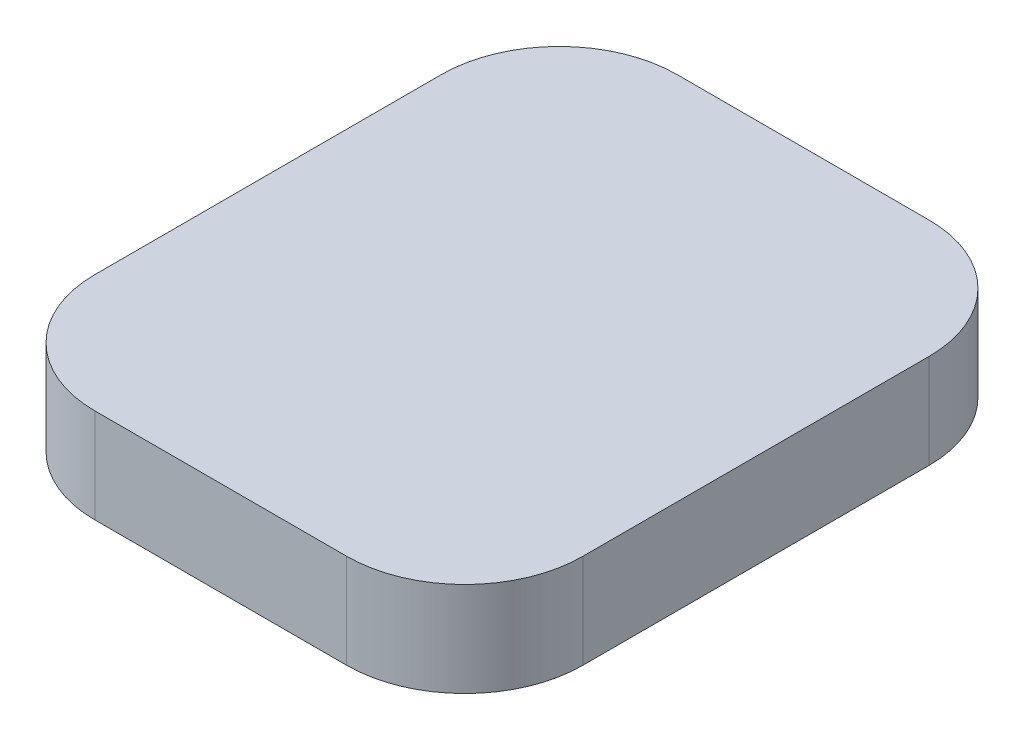
ISO-10303-21;
HEADER;
FILE_DESCRIPTION(('STEP AP214'),'2;1');
FILE_NAME('part.step','',(''),(''),'','','');
FILE_SCHEMA(('AUTOMOTIVE_DESIGN { 1 0 10303 214 1 1 1 1 }'));
ENDSEC;
DATA;
#1=APPLICATION_CONTEXT('core data for automotive mechanical design processes');
#2=APPLICATION_PROTOCOL_DEFINITION('international standard','automotive_design',2000,#1);
#3=PRODUCT_CONTEXT('',#1,'mechanical');
#4=PRODUCT('Part','Part','',(#3));
#5=PRODUCT_RELATED_PRODUCT_CATEGORY('part','',(#4));
#6=PRODUCT_DEFINITION_FORMATION('','',#4);
#7=PRODUCT_DEFINITION_CONTEXT('part definition',#1,'design');
#8=PRODUCT_DEFINITION('design','',#6,#7);
#9=PRODUCT_DEFINITION_SHAPE('','',#8);
#10=(LENGTH_UNIT() NAMED_UNIT(*) SI_UNIT(.MILLI.,.METRE.));
#11=(NAMED_UNIT(*) PLANE_ANGLE_UNIT() SI_UNIT($,.RADIAN.));
#12=(NAMED_UNIT(*) SI_UNIT($,.STERADIAN.) SOLID_ANGLE_UNIT());
#13=UNCERTAINTY_MEASURE_WITH_UNIT(LENGTH_MEASURE(1.E-05),#10,'distance_accuracy_value','');
#14=(GEOMETRIC_REPRESENTATION_CONTEXT(3) GLOBAL_UNCERTAINTY_ASSIGNED_CONTEXT((#13)) GLOBAL_UNIT_ASSIGNED_CONTEXT((#10,
#11,#12)) REPRESENTATION_CONTEXT('',''));
#15=CARTESIAN_POINT('',(0.,0.,0.));
#16=DIRECTION('',(0.,0.,1.));
#17=DIRECTION('',(1.,0.,0.));
#18=AXIS2_PLACEMENT_3D('',#15,#16,#17);
#19=CARTESIAN_POINT('',(3.49999999999999,3.,-5.5));
#20=DIRECTION('',(0.,-1.,0.));
#21=DIRECTION('',(0.,0.,-1.));
#22=AXIS2_PLACEMENT_3D('',#19,#20,#21);
#23=CYLINDRICAL_SURFACE('',#22,3.75);
#24=CARTESIAN_POINT('',(3.49999999999999,0.,-5.5));
#25=DIRECTION('',(0.,1.,0.));
#26=DIRECTION('',(0.,0.,-1.));
#27=AXIS2_PLACEMENT_3D('',#24,#25,#26);
#28=CIRCLE('',#27,3.75);
#29=CARTESIAN_POINT('',(7.24999999999999,0.,-5.5));
#30=VERTEX_POINT('',#29);
#31=CARTESIAN_POINT('',(3.49999999999999,0.,-9.25));
#32=VERTEX_POINT('',#31);
#33=EDGE_CURVE('E140',#30,#32,#28,.T.);
#34=ORIENTED_EDGE('',*,*,#33,.T.);
#35=DIRECTION('',(0.,-1.,0.));
#36=VECTOR('',#35,1.);
#37=CARTESIAN_POINT('',(3.49999999999999,3.,-9.25));
#38=LINE('',#37,#36);
#39=CARTESIAN_POINT('',(3.49999999999999,3.,-9.25));
#40=VERTEX_POINT('',#39);
#41=EDGE_CURVE('E11',#40,#32,#38,.T.);
#42=ORIENTED_EDGE('',*,*,#41,.F.);
#43=CARTESIAN_POINT('',(3.49999999999999,3.,-5.5));
#44=DIRECTION('',(0.,1.,0.));
#45=DIRECTION('',(0.,0.,-1.));
#46=AXIS2_PLACEMENT_3D('',#43,#44,#45);
#47=CIRCLE('',#46,3.75);
#48=CARTESIAN_POINT('',(7.24999999999999,3.,-5.5));
#49=VERTEX_POINT('',#48);
#50=EDGE_CURVE('E162',#49,#40,#47,.T.);
#51=ORIENTED_EDGE('',*,*,#50,.F.);
#52=DIRECTION('',(0.,-1.,0.));
#53=VECTOR('',#52,1.);
#54=CARTESIAN_POINT('',(7.24999999999999,3.,-5.5));
#55=LINE('',#54,#53);
#56=EDGE_CURVE('E136',#49,#30,#55,.T.);
#57=ORIENTED_EDGE('',*,*,#56,.T.);
#58=EDGE_LOOP('',(#34,#42,#51,#57));
#59=FACE_BOUND('',#58,.T.);
#60=ADVANCED_FACE('F39',(#59),#23,.T.);
#61=CARTESIAN_POINT('',(-4.5,3.,-9.24999999999998));
#62=DIRECTION('',(0.,0.,1.));
#63=DIRECTION('',(1.,0.,0.));
#64=AXIS2_PLACEMENT_3D('',#61,#62,#63);
#65=PLANE('',#64);
#66=DIRECTION('',(-1.,0.,0.));
#67=VECTOR('',#66,1.);
#68=CARTESIAN_POINT('',(-4.5,0.,-9.24999999999998));
#69=LINE('',#68,#67);
#70=CARTESIAN_POINT('',(-4.5,0.,-9.24999999999998));
#71=VERTEX_POINT('',#70);
#72=EDGE_CURVE('E144',#32,#71,#69,.T.);
#73=ORIENTED_EDGE('',*,*,#72,.T.);
#74=DIRECTION('',(0.,-1.,0.));
#75=VECTOR('',#74,1.);
#76=CARTESIAN_POINT('',(-4.5,3.,-9.24999999999998));
#77=LINE('',#76,#75);
#78=CARTESIAN_POINT('',(-4.5,3.,-9.24999999999998));
#79=VERTEX_POINT('',#78);
#80=EDGE_CURVE('E48',#79,#71,#77,.T.);
#81=ORIENTED_EDGE('',*,*,#80,.F.);
#82=DIRECTION('',(-1.,0.,0.));
#83=VECTOR('',#82,1.);
#84=CARTESIAN_POINT('',(-4.5,3.,-9.24999999999998));
#85=LINE('',#84,#83);
#86=EDGE_CURVE('E99',#40,#79,#85,.T.);
#87=ORIENTED_EDGE('',*,*,#86,.F.);
#88=ORIENTED_EDGE('',*,*,#41,.T.);
#89=EDGE_LOOP('',(#73,#81,#87,#88));
#90=FACE_BOUND('',#89,.T.);
#91=ADVANCED_FACE('F208',(#90),#65,.F.);
#92=CARTESIAN_POINT('',(-4.5,3.,-5.49999999999998));
#93=DIRECTION('',(0.,-1.,0.));
#94=DIRECTION('',(0.,0.,-1.));
#95=AXIS2_PLACEMENT_3D('',#92,#93,#94);
#96=CYLINDRICAL_SURFACE('',#95,3.75);
#97=CARTESIAN_POINT('',(-4.5,0.,-5.49999999999998));
#98=DIRECTION('',(0.,1.,0.));
#99=DIRECTION('',(0.,0.,-1.));
#100=AXIS2_PLACEMENT_3D('',#97,#98,#99);
#101=CIRCLE('',#100,3.75);
#102=CARTESIAN_POINT('',(-8.25000000000001,0.,-5.49999999999998));
#103=VERTEX_POINT('',#102);
#104=EDGE_CURVE('E147',#71,#103,#101,.T.);
#105=ORIENTED_EDGE('',*,*,#104,.T.);
#106=DIRECTION('',(0.,-1.,0.));
#107=VECTOR('',#106,1.);
#108=CARTESIAN_POINT('',(-8.25000000000001,3.,-5.49999999999998));
#109=LINE('',#108,#107);
#110=CARTESIAN_POINT('',(-8.25000000000001,3.,-5.49999999999998));
#111=VERTEX_POINT('',#110);
#112=EDGE_CURVE('E173',#111,#103,#109,.T.);
#113=ORIENTED_EDGE('',*,*,#112,.F.);
#114=CARTESIAN_POINT('',(-4.5,3.,-5.49999999999998));
#115=DIRECTION('',(0.,1.,0.));
#116=DIRECTION('',(0.,0.,-1.));
#117=AXIS2_PLACEMENT_3D('',#114,#115,#116);
#118=CIRCLE('',#117,3.75);
#119=EDGE_CURVE('E183',#79,#111,#118,.T.);
#120=ORIENTED_EDGE('',*,*,#119,.F.);
#121=ORIENTED_EDGE('',*,*,#80,.T.);
#122=EDGE_LOOP('',(#105,#113,#120,#121));
#123=FACE_BOUND('',#122,.T.);
#124=ADVANCED_FACE('F181',(#123),#96,.T.);
#125=CARTESIAN_POINT('',(-8.25000000000001,3.,-5.49999999999998));
#126=DIRECTION('',(1.,0.,0.));
#127=DIRECTION('',(0.,0.,-1.));
#128=AXIS2_PLACEMENT_3D('',#125,#126,#127);
#129=PLANE('',#128);
#130=DIRECTION('',(0.,0.,1.));
#131=VECTOR('',#130,1.);
#132=CARTESIAN_POINT('',(-8.25000000000001,0.,-5.49999999999998));
#133=LINE('',#132,#131);
#134=CARTESIAN_POINT('',(-8.25000000000001,0.,5.49999999999998));
#135=VERTEX_POINT('',#134);
#136=EDGE_CURVE('E150',#103,#135,#133,.T.);
#137=ORIENTED_EDGE('',*,*,#136,.T.);
#138=DIRECTION('',(0.,-1.,0.));
#139=VECTOR('',#138,1.);
#140=CARTESIAN_POINT('',(-8.25000000000001,3.,5.49999999999998));
#141=LINE('',#140,#139);
#142=CARTESIAN_POINT('',(-8.25000000000001,3.,5.49999999999998));
#143=VERTEX_POINT('',#142);
#144=EDGE_CURVE('E169',#143,#135,#141,.T.);
#145=ORIENTED_EDGE('',*,*,#144,.F.);
#146=DIRECTION('',(0.,0.,1.));
#147=VECTOR('',#146,1.);
#148=CARTESIAN_POINT('',(-8.25000000000001,3.,-5.49999999999998));
#149=LINE('',#148,#147);
#150=EDGE_CURVE('E196',#111,#143,#149,.T.);
#151=ORIENTED_EDGE('',*,*,#150,.F.);
#152=ORIENTED_EDGE('',*,*,#112,.T.);
#153=EDGE_LOOP('',(#137,#145,#151,#152));
#154=FACE_BOUND('',#153,.T.);
#155=ADVANCED_FACE('F191',(#154),#129,.F.);
#156=CARTESIAN_POINT('',(-4.5,3.,5.50000000000001));
#157=DIRECTION('',(0.,-1.,0.));
#158=DIRECTION('',(0.,0.,-1.));
#159=AXIS2_PLACEMENT_3D('',#156,#157,#158);
#160=CYLINDRICAL_SURFACE('',#159,3.75);
#161=CARTESIAN_POINT('',(-4.5,0.,5.50000000000001));
#162=DIRECTION('',(0.,1.,0.));
#163=DIRECTION('',(0.,0.,-1.));
#164=AXIS2_PLACEMENT_3D('',#161,#162,#163);
#165=CIRCLE('',#164,3.75);
#166=CARTESIAN_POINT('',(-4.5,0.,9.25000000000001));
#167=VERTEX_POINT('',#166);
#168=EDGE_CURVE('E153',#135,#167,#165,.T.);
#169=ORIENTED_EDGE('',*,*,#168,.T.);
#170=DIRECTION('',(0.,-1.,0.));
#171=VECTOR('',#170,1.);
#172=CARTESIAN_POINT('',(-4.5,3.,9.25000000000001));
#173=LINE('',#172,#171);
#174=CARTESIAN_POINT('',(-4.5,3.,9.25000000000001));
#175=VERTEX_POINT('',#174);
#176=EDGE_CURVE('E129',#175,#167,#173,.T.);
#177=ORIENTED_EDGE('',*,*,#176,.F.);
#178=CARTESIAN_POINT('',(-4.5,3.,5.50000000000001));
#179=DIRECTION('',(0.,1.,0.));
#180=DIRECTION('',(0.,0.,-1.));
#181=AXIS2_PLACEMENT_3D('',#178,#179,#180);
#182=CIRCLE('',#181,3.75);
#183=EDGE_CURVE('E118',#143,#175,#182,.T.);
#184=ORIENTED_EDGE('',*,*,#183,.F.);
#185=ORIENTED_EDGE('',*,*,#144,.T.);
#186=EDGE_LOOP('',(#169,#177,#184,#185));
#187=FACE_BOUND('',#186,.T.);
#188=ADVANCED_FACE('F194',(#187),#160,.T.);
#189=CARTESIAN_POINT('',(-4.5,3.,9.25000000000001));
#190=DIRECTION('',(0.,0.,-1.));
#191=DIRECTION('',(-1.,0.,0.));
#192=AXIS2_PLACEMENT_3D('',#189,#190,#191);
#193=PLANE('',#192);
#194=DIRECTION('',(1.,0.,0.));
#195=VECTOR('',#194,1.);
#196=CARTESIAN_POINT('',(-4.5,0.,9.25000000000001));
#197=LINE('',#196,#195);
#198=CARTESIAN_POINT('',(3.5,0.,9.25000000000001));
#199=VERTEX_POINT('',#198);
#200=EDGE_CURVE('E127',#167,#199,#197,.T.);
#201=ORIENTED_EDGE('',*,*,#200,.T.);
#202=DIRECTION('',(0.,-1.,0.));
#203=VECTOR('',#202,1.);
#204=CARTESIAN_POINT('',(3.5,3.,9.25000000000001));
#205=LINE('',#204,#203);
#206=CARTESIAN_POINT('',(3.5,3.,9.25000000000001));
#207=VERTEX_POINT('',#206);
#208=EDGE_CURVE('E124',#207,#199,#205,.T.);
#209=ORIENTED_EDGE('',*,*,#208,.F.);
#210=DIRECTION('',(1.,0.,0.));
#211=VECTOR('',#210,1.);
#212=CARTESIAN_POINT('',(-4.5,3.,9.25000000000001));
#213=LINE('',#212,#211);
#214=EDGE_CURVE('E112',#175,#207,#213,.T.);
#215=ORIENTED_EDGE('',*,*,#214,.F.);
#216=ORIENTED_EDGE('',*,*,#176,.T.);
#217=EDGE_LOOP('',(#201,#209,#215,#216));
#218=FACE_BOUND('',#217,.T.);
#219=ADVANCED_FACE('F125',(#218),#193,.F.);
#220=CARTESIAN_POINT('',(3.5,3.,5.50000000000001));
#221=DIRECTION('',(0.,-1.,0.));
#222=DIRECTION('',(0.,0.,-1.));
#223=AXIS2_PLACEMENT_3D('',#220,#221,#222);
#224=CYLINDRICAL_SURFACE('',#223,3.75);
#225=CARTESIAN_POINT('',(3.5,0.,5.50000000000001));
#226=DIRECTION('',(0.,1.,0.));
#227=DIRECTION('',(0.,0.,1.));
#228=AXIS2_PLACEMENT_3D('',#225,#226,#227);
#229=CIRCLE('',#228,3.75);
#230=CARTESIAN_POINT('',(7.25,0.,5.50000000000001));
#231=VERTEX_POINT('',#230);
#232=EDGE_CURVE('E85',#199,#231,#229,.T.);
#233=ORIENTED_EDGE('',*,*,#232,.T.);
#234=DIRECTION('',(0.,-1.,0.));
#235=VECTOR('',#234,1.);
#236=CARTESIAN_POINT('',(7.25,3.,5.50000000000001));
#237=LINE('',#236,#235);
#238=CARTESIAN_POINT('',(7.25,3.,5.50000000000001));
#239=VERTEX_POINT('',#238);
#240=EDGE_CURVE('E130',#239,#231,#237,.T.);
#241=ORIENTED_EDGE('',*,*,#240,.F.);
#242=CARTESIAN_POINT('',(3.5,3.,5.50000000000001));
#243=DIRECTION('',(0.,1.,0.));
#244=DIRECTION('',(0.,0.,1.));
#245=AXIS2_PLACEMENT_3D('',#242,#243,#244);
#246=CIRCLE('',#245,3.75);
#247=EDGE_CURVE('E116',#207,#239,#246,.T.);
#248=ORIENTED_EDGE('',*,*,#247,.F.);
#249=ORIENTED_EDGE('',*,*,#208,.T.);
#250=EDGE_LOOP('',(#233,#241,#248,#249));
#251=FACE_BOUND('',#250,.T.);
#252=ADVANCED_FACE('F132',(#251),#224,.T.);
#253=CARTESIAN_POINT('',(7.24999999999999,3.,-5.5));
#254=DIRECTION('',(-1.,0.,0.));
#255=DIRECTION('',(0.,0.,1.));
#256=AXIS2_PLACEMENT_3D('',#253,#254,#255);
#257=PLANE('',#256);
#258=DIRECTION('',(0.,0.,-1.));
#259=VECTOR('',#258,1.);
#260=CARTESIAN_POINT('',(7.24999999999999,0.,-5.5));
#261=LINE('',#260,#259);
#262=EDGE_CURVE('E91',#231,#30,#261,.T.);
#263=ORIENTED_EDGE('',*,*,#262,.T.);
#264=ORIENTED_EDGE('',*,*,#56,.F.);
#265=DIRECTION('',(0.,0.,-1.));
#266=VECTOR('',#265,1.);
#267=CARTESIAN_POINT('',(7.24999999999999,3.,-5.5));
#268=LINE('',#267,#266);
#269=EDGE_CURVE('E56',#239,#49,#268,.T.);
#270=ORIENTED_EDGE('',*,*,#269,.F.);
#271=ORIENTED_EDGE('',*,*,#240,.T.);
#272=EDGE_LOOP('',(#263,#264,#270,#271));
#273=FACE_BOUND('',#272,.T.);
#274=ADVANCED_FACE('F224',(#273),#257,.F.);
#275=CARTESIAN_POINT('',(3.49999999999999,3.,-5.5));
#276=DIRECTION('',(0.,-1.,0.));
#277=DIRECTION('',(0.,0.,-1.));
#278=AXIS2_PLACEMENT_3D('',#275,#276,#277);
#279=PLANE('',#278);
#280=ORIENTED_EDGE('',*,*,#50,.T.);
#281=ORIENTED_EDGE('',*,*,#86,.T.);
#282=ORIENTED_EDGE('',*,*,#119,.T.);
#283=ORIENTED_EDGE('',*,*,#150,.T.);
#284=ORIENTED_EDGE('',*,*,#183,.T.);
#285=ORIENTED_EDGE('',*,*,#214,.T.);
#286=ORIENTED_EDGE('',*,*,#247,.T.);
#287=ORIENTED_EDGE('',*,*,#269,.T.);
#288=EDGE_LOOP('',(#280,#281,#282,#283,#284,#285,#286,#287));
#289=FACE_BOUND('',#288,.T.);
#290=ADVANCED_FACE('F114',(#289),#279,.F.);
#291=CARTESIAN_POINT('',(3.49999999999999,0.,-5.5));
#292=DIRECTION('',(0.,-1.,0.));
#293=DIRECTION('',(0.,0.,-1.));
#294=AXIS2_PLACEMENT_3D('',#291,#292,#293);
#295=PLANE('',#294);
#296=ORIENTED_EDGE('',*,*,#33,.F.);
#297=ORIENTED_EDGE('',*,*,#262,.F.);
#298=ORIENTED_EDGE('',*,*,#232,.F.);
#299=ORIENTED_EDGE('',*,*,#200,.F.);
#300=ORIENTED_EDGE('',*,*,#168,.F.);
#301=ORIENTED_EDGE('',*,*,#136,.F.);
#302=ORIENTED_EDGE('',*,*,#104,.F.);
#303=ORIENTED_EDGE('',*,*,#72,.F.);
#304=EDGE_LOOP('',(#296,#297,#298,#299,#300,#301,#302,#303));
#305=FACE_BOUND('',#304,.T.);
#306=ADVANCED_FACE('F187',(#305),#295,.T.);
#307=CLOSED_SHELL('',(#60,#91,#124,#155,#188,#219,#252,#274,#290,#306));
#308=MANIFOLD_SOLID_BREP('B2',#307);
#309=ADVANCED_BREP_SHAPE_REPRESENTATION('',(#18,#308),#14);
#310=SHAPE_DEFINITION_REPRESENTATION(#9,#309);
ENDSEC;
END-ISO-10303-21;
